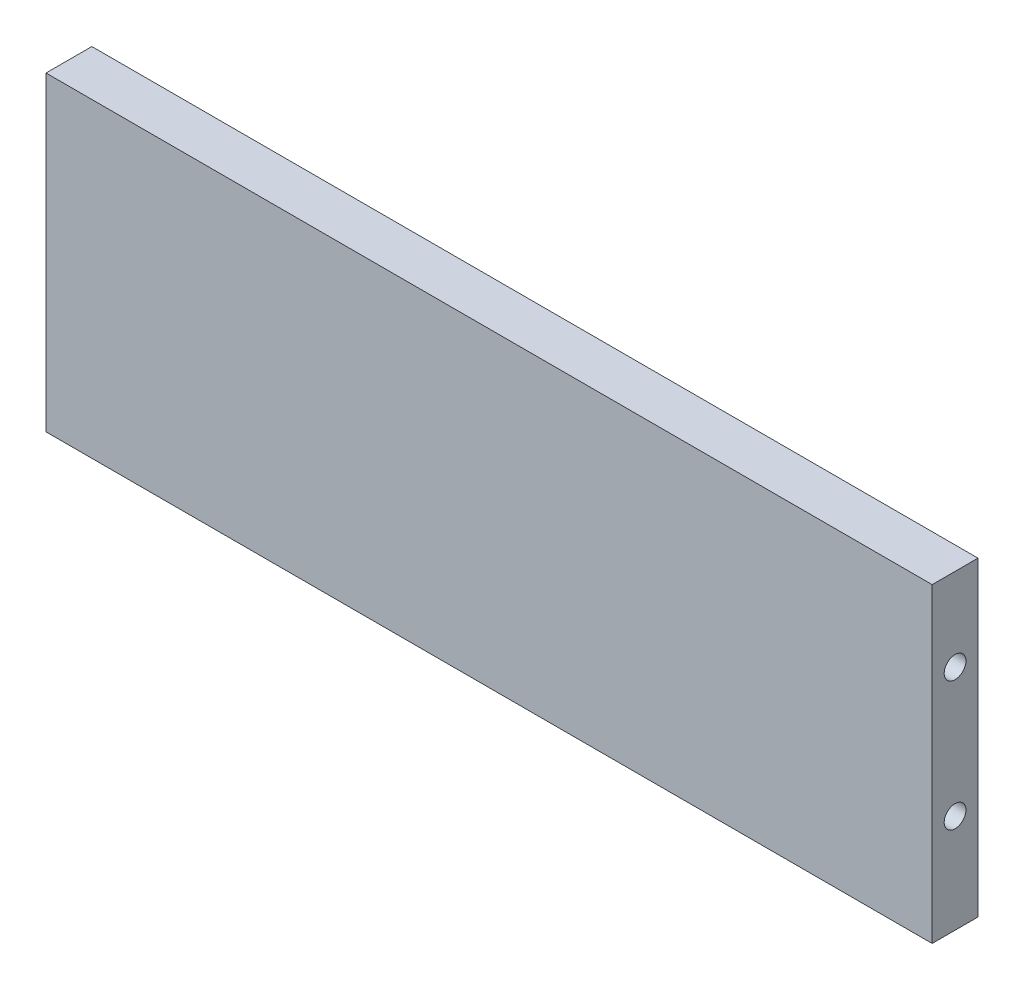
ISO-10303-21;
HEADER;
FILE_DESCRIPTION(('STEP AP214'),'2;1');
FILE_NAME('part.step','',(''),(''),'','','');
FILE_SCHEMA(('AUTOMOTIVE_DESIGN { 1 0 10303 214 1 1 1 1 }'));
ENDSEC;
DATA;
#1=APPLICATION_CONTEXT('core data for automotive mechanical design processes');
#2=APPLICATION_PROTOCOL_DEFINITION('international standard','automotive_design',2000,#1);
#3=PRODUCT_CONTEXT('',#1,'mechanical');
#4=PRODUCT('Part','Part','',(#3));
#5=PRODUCT_RELATED_PRODUCT_CATEGORY('part','',(#4));
#6=PRODUCT_DEFINITION_FORMATION('','',#4);
#7=PRODUCT_DEFINITION_CONTEXT('part definition',#1,'design');
#8=PRODUCT_DEFINITION('design','',#6,#7);
#9=PRODUCT_DEFINITION_SHAPE('','',#8);
#10=(LENGTH_UNIT() NAMED_UNIT(*) SI_UNIT(.MILLI.,.METRE.));
#11=(NAMED_UNIT(*) PLANE_ANGLE_UNIT() SI_UNIT($,.RADIAN.));
#12=(NAMED_UNIT(*) SI_UNIT($,.STERADIAN.) SOLID_ANGLE_UNIT());
#13=UNCERTAINTY_MEASURE_WITH_UNIT(LENGTH_MEASURE(1.E-05),#10,'distance_accuracy_value','');
#14=(GEOMETRIC_REPRESENTATION_CONTEXT(3) GLOBAL_UNCERTAINTY_ASSIGNED_CONTEXT((#13)) GLOBAL_UNIT_ASSIGNED_CONTEXT((#10,
#11,#12)) REPRESENTATION_CONTEXT('',''));
#15=CARTESIAN_POINT('',(0.,0.,0.));
#16=DIRECTION('',(0.,0.,1.));
#17=DIRECTION('',(1.,0.,0.));
#18=AXIS2_PLACEMENT_3D('',#15,#16,#17);
#19=CARTESIAN_POINT('',(-20.6248,2.90830000000002,2.38125));
#20=DIRECTION('',(0.,-1.,0.));
#21=DIRECTION('',(0.,0.,-1.));
#22=AXIS2_PLACEMENT_3D('',#19,#20,#21);
#23=CYLINDRICAL_SURFACE('',#22,1.1303);
#24=CARTESIAN_POINT('',(-20.6248,-16.1417,2.38125));
#25=DIRECTION('',(0.,-1.,0.));
#26=DIRECTION('',(0.,0.,-1.));
#27=AXIS2_PLACEMENT_3D('',#24,#25,#26);
#28=CIRCLE('',#27,1.1303);
#29=CARTESIAN_POINT('',(-20.6248,-16.1417,1.25095));
#30=VERTEX_POINT('',#29);
#31=EDGE_CURVE('E131',#30,#30,#28,.T.);
#32=ORIENTED_EDGE('',*,*,#31,.T.);
#33=EDGE_LOOP('',(#32));
#34=FACE_BOUND('',#33,.T.);
#35=CARTESIAN_POINT('',(-20.6248,-5.88009999999999,2.38125));
#36=DIRECTION('',(0.707106781186548,-0.707106781186547,0.));
#37=DIRECTION('',(-0.707106781186548,-0.707106781186547,0.));
#38=AXIS2_PLACEMENT_3D('',#35,#36,#37);
#39=ELLIPSE('',#38,1.59848558955031,1.1303);
#40=CARTESIAN_POINT('',(-20.6248,-5.88009999999999,1.25095));
#41=VERTEX_POINT('',#40);
#42=CARTESIAN_POINT('',(-20.6248,-5.88009999999999,3.51155));
#43=VERTEX_POINT('',#42);
#44=EDGE_CURVE('E47',#41,#43,#39,.F.);
#45=ORIENTED_EDGE('',*,*,#44,.T.);
#46=CARTESIAN_POINT('',(-20.6248,-5.88009999999999,2.38125));
#47=DIRECTION('',(-0.707106781186548,-0.707106781186547,0.));
#48=DIRECTION('',(0.707106781186548,-0.707106781186547,0.));
#49=AXIS2_PLACEMENT_3D('',#46,#47,#48);
#50=ELLIPSE('',#49,1.59848558955031,1.1303);
#51=EDGE_CURVE('E146',#43,#41,#50,.F.);
#52=ORIENTED_EDGE('',*,*,#51,.T.);
#53=EDGE_LOOP('',(#45,#52));
#54=FACE_BOUND('',#53,.T.);
#55=ADVANCED_FACE('F33',(#34,#54),#23,.F.);
#56=CARTESIAN_POINT('',(20.6248,2.90830000000002,2.38125));
#57=DIRECTION('',(0.,-1.,0.));
#58=DIRECTION('',(0.,0.,-1.));
#59=AXIS2_PLACEMENT_3D('',#56,#57,#58);
#60=CYLINDRICAL_SURFACE('',#59,1.1303);
#61=CARTESIAN_POINT('',(20.6248,-16.1417,2.38125));
#62=DIRECTION('',(0.,-1.,0.));
#63=DIRECTION('',(0.,0.,-1.));
#64=AXIS2_PLACEMENT_3D('',#61,#62,#63);
#65=CIRCLE('',#64,1.1303);
#66=CARTESIAN_POINT('',(20.6248,-16.1417,1.25095));
#67=VERTEX_POINT('',#66);
#68=EDGE_CURVE('E137',#67,#67,#65,.T.);
#69=ORIENTED_EDGE('',*,*,#68,.T.);
#70=EDGE_LOOP('',(#69));
#71=FACE_BOUND('',#70,.T.);
#72=CARTESIAN_POINT('',(20.6248,-5.88009999999999,2.38125));
#73=DIRECTION('',(0.707106781186548,-0.707106781186547,0.));
#74=DIRECTION('',(-0.707106781186548,-0.707106781186547,0.));
#75=AXIS2_PLACEMENT_3D('',#72,#73,#74);
#76=ELLIPSE('',#75,1.59848558955031,1.1303);
#77=CARTESIAN_POINT('',(20.6248,-5.88009999999999,1.25095));
#78=VERTEX_POINT('',#77);
#79=CARTESIAN_POINT('',(20.6248,-5.88009999999999,3.51155));
#80=VERTEX_POINT('',#79);
#81=EDGE_CURVE('E53',#78,#80,#76,.F.);
#82=ORIENTED_EDGE('',*,*,#81,.T.);
#83=CARTESIAN_POINT('',(20.6248,-5.88009999999999,2.38125));
#84=DIRECTION('',(-0.707106781186548,-0.707106781186547,0.));
#85=DIRECTION('',(0.707106781186548,-0.707106781186547,0.));
#86=AXIS2_PLACEMENT_3D('',#83,#84,#85);
#87=ELLIPSE('',#86,1.59848558955031,1.1303);
#88=EDGE_CURVE('E11',#80,#78,#87,.F.);
#89=ORIENTED_EDGE('',*,*,#88,.T.);
#90=EDGE_LOOP('',(#82,#89));
#91=FACE_BOUND('',#90,.T.);
#92=ADVANCED_FACE('F97',(#71,#91),#60,.F.);
#93=CARTESIAN_POINT('',(46.0248,-16.1417,4.7625));
#94=DIRECTION('',(-1.,0.,0.));
#95=DIRECTION('',(0.,0.,1.));
#96=AXIS2_PLACEMENT_3D('',#93,#94,#95);
#97=PLANE('',#96);
#98=CARTESIAN_POINT('',(46.0248,-5.88009999999999,2.38125));
#99=DIRECTION('',(-1.,0.,0.));
#100=DIRECTION('',(0.,0.,1.));
#101=AXIS2_PLACEMENT_3D('',#98,#99,#100);
#102=CIRCLE('',#101,1.1303);
#103=CARTESIAN_POINT('',(46.0248,-5.88009999999999,3.51155));
#104=VERTEX_POINT('',#103);
#105=EDGE_CURVE('E157',#104,#104,#102,.T.);
#106=ORIENTED_EDGE('',*,*,#105,.T.);
#107=EDGE_LOOP('',(#106));
#108=FACE_BOUND('',#107,.T.);
#109=CARTESIAN_POINT('',(46.0248,7.53110000000001,2.38125));
#110=DIRECTION('',(-1.,0.,0.));
#111=DIRECTION('',(0.,0.,1.));
#112=AXIS2_PLACEMENT_3D('',#109,#110,#111);
#113=CIRCLE('',#112,1.1303);
#114=CARTESIAN_POINT('',(46.0248,7.53110000000001,3.51155));
#115=VERTEX_POINT('',#114);
#116=EDGE_CURVE('E140',#115,#115,#113,.T.);
#117=ORIENTED_EDGE('',*,*,#116,.T.);
#118=EDGE_LOOP('',(#117));
#119=FACE_BOUND('',#118,.T.);
#120=DIRECTION('',(0.,1.,0.));
#121=VECTOR('',#120,1.);
#122=CARTESIAN_POINT('',(46.0248,-16.1417,0.));
#123=LINE('',#122,#121);
#124=CARTESIAN_POINT('',(46.0248,-16.1417,0.));
#125=VERTEX_POINT('',#124);
#126=CARTESIAN_POINT('',(46.0248,16.1417,0.));
#127=VERTEX_POINT('',#126);
#128=EDGE_CURVE('E120',#125,#127,#123,.T.);
#129=ORIENTED_EDGE('',*,*,#128,.T.);
#130=DIRECTION('',(0.,0.,-1.));
#131=VECTOR('',#130,1.);
#132=CARTESIAN_POINT('',(46.0248,16.1417,4.7625));
#133=LINE('',#132,#131);
#134=CARTESIAN_POINT('',(46.0248,16.1417,4.7625));
#135=VERTEX_POINT('',#134);
#136=EDGE_CURVE('E95',#135,#127,#133,.T.);
#137=ORIENTED_EDGE('',*,*,#136,.F.);
#138=DIRECTION('',(0.,1.,0.));
#139=VECTOR('',#138,1.);
#140=CARTESIAN_POINT('',(46.0248,-16.1417,4.7625));
#141=LINE('',#140,#139);
#142=CARTESIAN_POINT('',(46.0248,-16.1417,4.7625));
#143=VERTEX_POINT('',#142);
#144=EDGE_CURVE('E115',#143,#135,#141,.T.);
#145=ORIENTED_EDGE('',*,*,#144,.F.);
#146=DIRECTION('',(0.,0.,-1.));
#147=VECTOR('',#146,1.);
#148=CARTESIAN_POINT('',(46.0248,-16.1417,4.7625));
#149=LINE('',#148,#147);
#150=EDGE_CURVE('E109',#143,#125,#149,.T.);
#151=ORIENTED_EDGE('',*,*,#150,.T.);
#152=EDGE_LOOP('',(#129,#137,#145,#151));
#153=FACE_BOUND('',#152,.T.);
#154=ADVANCED_FACE('F35',(#108,#119,#153),#97,.F.);
#155=CARTESIAN_POINT('',(-46.0248,16.1417,4.7625));
#156=DIRECTION('',(0.,-1.,0.));
#157=DIRECTION('',(0.,0.,-1.));
#158=AXIS2_PLACEMENT_3D('',#155,#156,#157);
#159=PLANE('',#158);
#160=DIRECTION('',(-1.,0.,0.));
#161=VECTOR('',#160,1.);
#162=CARTESIAN_POINT('',(-46.0248,16.1417,0.));
#163=LINE('',#162,#161);
#164=CARTESIAN_POINT('',(-46.0248,16.1417,0.));
#165=VERTEX_POINT('',#164);
#166=EDGE_CURVE('E118',#127,#165,#163,.T.);
#167=ORIENTED_EDGE('',*,*,#166,.T.);
#168=DIRECTION('',(0.,0.,-1.));
#169=VECTOR('',#168,1.);
#170=CARTESIAN_POINT('',(-46.0248,16.1417,4.7625));
#171=LINE('',#170,#169);
#172=CARTESIAN_POINT('',(-46.0248,16.1417,4.7625));
#173=VERTEX_POINT('',#172);
#174=EDGE_CURVE('E103',#173,#165,#171,.T.);
#175=ORIENTED_EDGE('',*,*,#174,.F.);
#176=DIRECTION('',(-1.,0.,0.));
#177=VECTOR('',#176,1.);
#178=CARTESIAN_POINT('',(-46.0248,16.1417,4.7625));
#179=LINE('',#178,#177);
#180=EDGE_CURVE('E127',#135,#173,#179,.T.);
#181=ORIENTED_EDGE('',*,*,#180,.F.);
#182=ORIENTED_EDGE('',*,*,#136,.T.);
#183=EDGE_LOOP('',(#167,#175,#181,#182));
#184=FACE_BOUND('',#183,.T.);
#185=ADVANCED_FACE('F222',(#184),#159,.F.);
#186=CARTESIAN_POINT('',(-46.0248,-16.1417,4.7625));
#187=DIRECTION('',(1.,0.,0.));
#188=DIRECTION('',(0.,0.,-1.));
#189=AXIS2_PLACEMENT_3D('',#186,#187,#188);
#190=PLANE('',#189);
#191=CARTESIAN_POINT('',(-46.0248,-5.88009999999999,2.38125));
#192=DIRECTION('',(-1.,0.,0.));
#193=DIRECTION('',(0.,0.,1.));
#194=AXIS2_PLACEMENT_3D('',#191,#192,#193);
#195=CIRCLE('',#194,1.1303);
#196=CARTESIAN_POINT('',(-46.0248,-5.88009999999999,3.51155));
#197=VERTEX_POINT('',#196);
#198=EDGE_CURVE('E158',#197,#197,#195,.T.);
#199=ORIENTED_EDGE('',*,*,#198,.F.);
#200=EDGE_LOOP('',(#199));
#201=FACE_BOUND('',#200,.T.);
#202=CARTESIAN_POINT('',(-46.0248,7.53110000000001,2.38125));
#203=DIRECTION('',(-1.,0.,0.));
#204=DIRECTION('',(0.,0.,1.));
#205=AXIS2_PLACEMENT_3D('',#202,#203,#204);
#206=CIRCLE('',#205,1.1303);
#207=CARTESIAN_POINT('',(-46.0248,7.53110000000001,3.51155));
#208=VERTEX_POINT('',#207);
#209=EDGE_CURVE('E143',#208,#208,#206,.T.);
#210=ORIENTED_EDGE('',*,*,#209,.F.);
#211=EDGE_LOOP('',(#210));
#212=FACE_BOUND('',#211,.T.);
#213=DIRECTION('',(0.,-1.,0.));
#214=VECTOR('',#213,1.);
#215=CARTESIAN_POINT('',(-46.0248,-16.1417,0.));
#216=LINE('',#215,#214);
#217=CARTESIAN_POINT('',(-46.0248,-16.1417,0.));
#218=VERTEX_POINT('',#217);
#219=EDGE_CURVE('E116',#165,#218,#216,.T.);
#220=ORIENTED_EDGE('',*,*,#219,.T.);
#221=DIRECTION('',(0.,0.,-1.));
#222=VECTOR('',#221,1.);
#223=CARTESIAN_POINT('',(-46.0248,-16.1417,4.7625));
#224=LINE('',#223,#222);
#225=CARTESIAN_POINT('',(-46.0248,-16.1417,4.7625));
#226=VERTEX_POINT('',#225);
#227=EDGE_CURVE('E106',#226,#218,#224,.T.);
#228=ORIENTED_EDGE('',*,*,#227,.F.);
#229=DIRECTION('',(0.,-1.,0.));
#230=VECTOR('',#229,1.);
#231=CARTESIAN_POINT('',(-46.0248,-16.1417,4.7625));
#232=LINE('',#231,#230);
#233=EDGE_CURVE('E125',#173,#226,#232,.T.);
#234=ORIENTED_EDGE('',*,*,#233,.F.);
#235=ORIENTED_EDGE('',*,*,#174,.T.);
#236=EDGE_LOOP('',(#220,#228,#234,#235));
#237=FACE_BOUND('',#236,.T.);
#238=ADVANCED_FACE('F218',(#201,#212,#237),#190,.F.);
#239=CARTESIAN_POINT('',(-46.0248,-16.1417,4.7625));
#240=DIRECTION('',(0.,1.,0.));
#241=DIRECTION('',(0.,0.,1.));
#242=AXIS2_PLACEMENT_3D('',#239,#240,#241);
#243=PLANE('',#242);
#244=ORIENTED_EDGE('',*,*,#68,.F.);
#245=EDGE_LOOP('',(#244));
#246=FACE_BOUND('',#245,.T.);
#247=ORIENTED_EDGE('',*,*,#31,.F.);
#248=EDGE_LOOP('',(#247));
#249=FACE_BOUND('',#248,.T.);
#250=DIRECTION('',(1.,0.,0.));
#251=VECTOR('',#250,1.);
#252=CARTESIAN_POINT('',(-46.0248,-16.1417,0.));
#253=LINE('',#252,#251);
#254=EDGE_CURVE('E113',#218,#125,#253,.T.);
#255=ORIENTED_EDGE('',*,*,#254,.T.);
#256=ORIENTED_EDGE('',*,*,#150,.F.);
#257=DIRECTION('',(1.,0.,0.));
#258=VECTOR('',#257,1.);
#259=CARTESIAN_POINT('',(-46.0248,-16.1417,4.7625));
#260=LINE('',#259,#258);
#261=EDGE_CURVE('E112',#226,#143,#260,.T.);
#262=ORIENTED_EDGE('',*,*,#261,.F.);
#263=ORIENTED_EDGE('',*,*,#227,.T.);
#264=EDGE_LOOP('',(#255,#256,#262,#263));
#265=FACE_BOUND('',#264,.T.);
#266=ADVANCED_FACE('F221',(#246,#249,#265),#243,.F.);
#267=CARTESIAN_POINT('',(46.0248,16.1417,4.7625));
#268=DIRECTION('',(0.,0.,-1.));
#269=DIRECTION('',(-1.,0.,0.));
#270=AXIS2_PLACEMENT_3D('',#267,#268,#269);
#271=PLANE('',#270);
#272=ORIENTED_EDGE('',*,*,#144,.T.);
#273=ORIENTED_EDGE('',*,*,#180,.T.);
#274=ORIENTED_EDGE('',*,*,#233,.T.);
#275=ORIENTED_EDGE('',*,*,#261,.T.);
#276=EDGE_LOOP('',(#272,#273,#274,#275));
#277=FACE_BOUND('',#276,.T.);
#278=ADVANCED_FACE('F211',(#277),#271,.F.);
#279=CARTESIAN_POINT('',(46.0248,16.1417,0.));
#280=DIRECTION('',(0.,0.,-1.));
#281=DIRECTION('',(-1.,0.,0.));
#282=AXIS2_PLACEMENT_3D('',#279,#280,#281);
#283=PLANE('',#282);
#284=ORIENTED_EDGE('',*,*,#128,.F.);
#285=ORIENTED_EDGE('',*,*,#254,.F.);
#286=ORIENTED_EDGE('',*,*,#219,.F.);
#287=ORIENTED_EDGE('',*,*,#166,.F.);
#288=EDGE_LOOP('',(#284,#285,#286,#287));
#289=FACE_BOUND('',#288,.T.);
#290=ADVANCED_FACE('F207',(#289),#283,.T.);
#291=CARTESIAN_POINT('',(46.0248,7.53110000000001,2.38125));
#292=DIRECTION('',(-1.,0.,0.));
#293=DIRECTION('',(0.,0.,1.));
#294=AXIS2_PLACEMENT_3D('',#291,#292,#293);
#295=CYLINDRICAL_SURFACE('',#294,1.1303);
#296=ORIENTED_EDGE('',*,*,#116,.F.);
#297=EDGE_LOOP('',(#296));
#298=FACE_BOUND('',#297,.T.);
#299=ORIENTED_EDGE('',*,*,#209,.T.);
#300=EDGE_LOOP('',(#299));
#301=FACE_BOUND('',#300,.T.);
#302=ADVANCED_FACE('F179',(#298,#301),#295,.F.);
#303=CARTESIAN_POINT('',(46.0248,-5.88009999999999,2.38125));
#304=DIRECTION('',(-1.,0.,0.));
#305=DIRECTION('',(0.,0.,1.));
#306=AXIS2_PLACEMENT_3D('',#303,#304,#305);
#307=CYLINDRICAL_SURFACE('',#306,1.1303);
#308=ORIENTED_EDGE('',*,*,#81,.F.);
#309=CARTESIAN_POINT('',(20.6248,-5.88009999999999,2.38125));
#310=DIRECTION('',(-0.707106781186548,-0.707106781186547,0.));
#311=DIRECTION('',(0.707106781186548,-0.707106781186547,0.));
#312=AXIS2_PLACEMENT_3D('',#309,#310,#311);
#313=ELLIPSE('',#312,1.59848558955031,1.1303);
#314=EDGE_CURVE('E41',#80,#78,#313,.T.);
#315=ORIENTED_EDGE('',*,*,#314,.F.);
#316=EDGE_LOOP('',(#308,#315));
#317=FACE_BOUND('',#316,.T.);
#318=CARTESIAN_POINT('',(-20.6248,-5.88009999999999,2.38125));
#319=DIRECTION('',(0.707106781186548,-0.707106781186547,0.));
#320=DIRECTION('',(-0.707106781186548,-0.707106781186547,0.));
#321=AXIS2_PLACEMENT_3D('',#318,#319,#320);
#322=ELLIPSE('',#321,1.59848558955031,1.1303);
#323=EDGE_CURVE('E153',#41,#43,#322,.T.);
#324=ORIENTED_EDGE('',*,*,#323,.F.);
#325=ORIENTED_EDGE('',*,*,#51,.F.);
#326=EDGE_LOOP('',(#324,#325));
#327=FACE_BOUND('',#326,.T.);
#328=ADVANCED_FACE('F93',(#317,#327),#307,.F.);
#329=CARTESIAN_POINT('',(20.6248,2.90830000000002,2.38125));
#330=DIRECTION('',(0.,-1.,0.));
#331=DIRECTION('',(0.,0.,-1.));
#332=AXIS2_PLACEMENT_3D('',#329,#330,#331);
#333=PLANE('',#332);
#334=CARTESIAN_POINT('',(20.6248,2.90830000000002,2.38125));
#335=DIRECTION('',(0.,-1.,0.));
#336=DIRECTION('',(0.,0.,-1.));
#337=AXIS2_PLACEMENT_3D('',#334,#335,#336);
#338=CIRCLE('',#337,1.1303);
#339=CARTESIAN_POINT('',(20.6248,2.90830000000002,1.25095));
#340=VERTEX_POINT('',#339);
#341=EDGE_CURVE('E134',#340,#340,#338,.T.);
#342=ORIENTED_EDGE('',*,*,#341,.T.);
#343=EDGE_LOOP('',(#342));
#344=FACE_BOUND('',#343,.T.);
#345=ADVANCED_FACE('F175',(#344),#333,.T.);
#346=CARTESIAN_POINT('',(20.6248,-5.88009999999999,2.38125));
#347=DIRECTION('',(0.707106781186548,-0.707106781186547,0.));
#348=DIRECTION('',(-0.707106781186548,-0.707106781186547,0.));
#349=AXIS2_PLACEMENT_3D('',#346,#347,#348);
#350=ELLIPSE('',#349,1.59848558955031,1.1303);
#351=EDGE_CURVE('E87',#78,#80,#350,.T.);
#352=ORIENTED_EDGE('',*,*,#351,.T.);
#353=ORIENTED_EDGE('',*,*,#314,.T.);
#354=EDGE_LOOP('',(#352,#353));
#355=FACE_BOUND('',#354,.T.);
#356=ORIENTED_EDGE('',*,*,#341,.F.);
#357=EDGE_LOOP('',(#356));
#358=FACE_BOUND('',#357,.T.);
#359=ADVANCED_FACE('F98',(#355,#358),#60,.F.);
#360=ORIENTED_EDGE('',*,*,#105,.F.);
#361=EDGE_LOOP('',(#360));
#362=FACE_BOUND('',#361,.T.);
#363=ORIENTED_EDGE('',*,*,#351,.F.);
#364=ORIENTED_EDGE('',*,*,#88,.F.);
#365=EDGE_LOOP('',(#363,#364));
#366=FACE_BOUND('',#365,.T.);
#367=ADVANCED_FACE('F88',(#362,#366),#307,.F.);
#368=ORIENTED_EDGE('',*,*,#198,.T.);
#369=EDGE_LOOP('',(#368));
#370=FACE_BOUND('',#369,.T.);
#371=ORIENTED_EDGE('',*,*,#44,.F.);
#372=CARTESIAN_POINT('',(-20.6248,-5.88009999999999,2.38125));
#373=DIRECTION('',(-0.707106781186548,-0.707106781186547,0.));
#374=DIRECTION('',(0.707106781186548,-0.707106781186547,0.));
#375=AXIS2_PLACEMENT_3D('',#372,#373,#374);
#376=ELLIPSE('',#375,1.59848558955031,1.1303);
#377=EDGE_CURVE('E150',#43,#41,#376,.T.);
#378=ORIENTED_EDGE('',*,*,#377,.F.);
#379=EDGE_LOOP('',(#371,#378));
#380=FACE_BOUND('',#379,.T.);
#381=ADVANCED_FACE('F167',(#370,#380),#307,.F.);
#382=CARTESIAN_POINT('',(-20.6248,2.90830000000002,2.38125));
#383=DIRECTION('',(0.,-1.,0.));
#384=DIRECTION('',(0.,0.,-1.));
#385=AXIS2_PLACEMENT_3D('',#382,#383,#384);
#386=PLANE('',#385);
#387=CARTESIAN_POINT('',(-20.6248,2.90830000000002,2.38125));
#388=DIRECTION('',(0.,-1.,0.));
#389=DIRECTION('',(0.,0.,-1.));
#390=AXIS2_PLACEMENT_3D('',#387,#388,#389);
#391=CIRCLE('',#390,1.1303);
#392=CARTESIAN_POINT('',(-20.6248,2.90830000000002,1.25095));
#393=VERTEX_POINT('',#392);
#394=EDGE_CURVE('E123',#393,#393,#391,.T.);
#395=ORIENTED_EDGE('',*,*,#394,.T.);
#396=EDGE_LOOP('',(#395));
#397=FACE_BOUND('',#396,.T.);
#398=ADVANCED_FACE('F173',(#397),#386,.T.);
#399=ORIENTED_EDGE('',*,*,#323,.T.);
#400=ORIENTED_EDGE('',*,*,#377,.T.);
#401=EDGE_LOOP('',(#399,#400));
#402=FACE_BOUND('',#401,.T.);
#403=ORIENTED_EDGE('',*,*,#394,.F.);
#404=EDGE_LOOP('',(#403));
#405=FACE_BOUND('',#404,.T.);
#406=ADVANCED_FACE('F183',(#402,#405),#23,.F.);
#407=CLOSED_SHELL('',(#55,#92,#154,#185,#238,#266,#278,#290,#302,#328,#345,#359,#367,#381,#398,#406));
#408=MANIFOLD_SOLID_BREP('B2',#407);
#409=ADVANCED_BREP_SHAPE_REPRESENTATION('',(#18,#408),#14);
#410=SHAPE_DEFINITION_REPRESENTATION(#9,#409);
ENDSEC;
END-ISO-10303-21;
